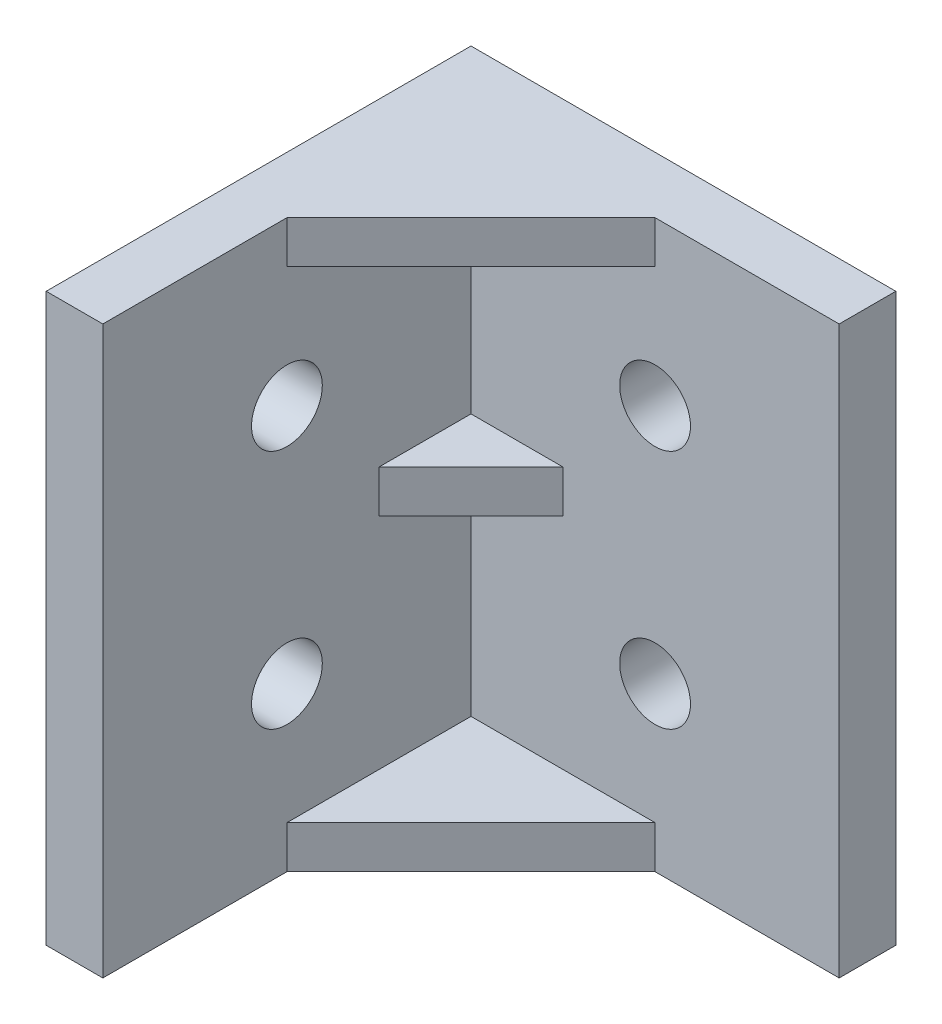
ISO-10303-21;
HEADER;
FILE_DESCRIPTION(('STEP AP214'),'2;1');
FILE_NAME('part.step','',(''),(''),'','','');
FILE_SCHEMA(('AUTOMOTIVE_DESIGN { 1 0 10303 214 1 1 1 1 }'));
ENDSEC;
DATA;
#1=APPLICATION_CONTEXT('core data for automotive mechanical design processes');
#2=APPLICATION_PROTOCOL_DEFINITION('international standard','automotive_design',2000,#1);
#3=PRODUCT_CONTEXT('',#1,'mechanical');
#4=PRODUCT('Part','Part','',(#3));
#5=PRODUCT_RELATED_PRODUCT_CATEGORY('part','',(#4));
#6=PRODUCT_DEFINITION_FORMATION('','',#4);
#7=PRODUCT_DEFINITION_CONTEXT('part definition',#1,'design');
#8=PRODUCT_DEFINITION('design','',#6,#7);
#9=PRODUCT_DEFINITION_SHAPE('','',#8);
#10=(LENGTH_UNIT() NAMED_UNIT(*) SI_UNIT(.MILLI.,.METRE.));
#11=(NAMED_UNIT(*) PLANE_ANGLE_UNIT() SI_UNIT($,.RADIAN.));
#12=(NAMED_UNIT(*) SI_UNIT($,.STERADIAN.) SOLID_ANGLE_UNIT());
#13=UNCERTAINTY_MEASURE_WITH_UNIT(LENGTH_MEASURE(1.E-05),#10,'distance_accuracy_value','');
#14=(GEOMETRIC_REPRESENTATION_CONTEXT(3) GLOBAL_UNCERTAINTY_ASSIGNED_CONTEXT((#13)) GLOBAL_UNIT_ASSIGNED_CONTEXT((#10,
#11,#12)) REPRESENTATION_CONTEXT('',''));
#15=CARTESIAN_POINT('',(0.,0.,0.));
#16=DIRECTION('',(0.,0.,1.));
#17=DIRECTION('',(1.,0.,0.));
#18=AXIS2_PLACEMENT_3D('',#15,#16,#17);
#19=CARTESIAN_POINT('',(-23.5152207469861,20.,-12.3737755770845));
#20=DIRECTION('',(1.,0.,0.));
#21=DIRECTION('',(0.,0.,-1.));
#22=AXIS2_PLACEMENT_3D('',#19,#20,#21);
#23=PLANE('',#22);
#24=CARTESIAN_POINT('',(-23.5152207469861,8.5,4.62622442291549));
#25=DIRECTION('',(1.,0.,0.));
#26=DIRECTION('',(0.,0.,-1.));
#27=AXIS2_PLACEMENT_3D('',#24,#25,#26);
#28=CIRCLE('',#27,2.5);
#29=CARTESIAN_POINT('',(-23.5152207469861,8.5,2.12622442291549));
#30=VERTEX_POINT('',#29);
#31=EDGE_CURVE('E274',#30,#30,#28,.T.);
#32=ORIENTED_EDGE('',*,*,#31,.T.);
#33=EDGE_LOOP('',(#32));
#34=FACE_BOUND('',#33,.T.);
#35=CARTESIAN_POINT('',(-23.5152207469861,-8.5,4.62622442291549));
#36=DIRECTION('',(1.,0.,0.));
#37=DIRECTION('',(0.,0.,-1.));
#38=AXIS2_PLACEMENT_3D('',#35,#36,#37);
#39=CIRCLE('',#38,2.5);
#40=CARTESIAN_POINT('',(-23.5152207469861,-8.5,2.12622442291549));
#41=VERTEX_POINT('',#40);
#42=EDGE_CURVE('E144',#41,#41,#39,.T.);
#43=ORIENTED_EDGE('',*,*,#42,.T.);
#44=EDGE_LOOP('',(#43));
#45=FACE_BOUND('',#44,.T.);
#46=DIRECTION('',(0.,0.,1.));
#47=VECTOR('',#46,1.);
#48=CARTESIAN_POINT('',(-23.5152207469861,-20.,-12.3737755770845));
#49=LINE('',#48,#47);
#50=CARTESIAN_POINT('',(-23.5152207469861,-20.,-12.3737755770845));
#51=VERTEX_POINT('',#50);
#52=CARTESIAN_POINT('',(-23.5152207469861,-20.,17.6262244229155));
#53=VERTEX_POINT('',#52);
#54=EDGE_CURVE('E185',#51,#53,#49,.T.);
#55=ORIENTED_EDGE('',*,*,#54,.T.);
#56=DIRECTION('',(0.,-1.,0.));
#57=VECTOR('',#56,1.);
#58=CARTESIAN_POINT('',(-23.5152207469861,20.,17.6262244229155));
#59=LINE('',#58,#57);
#60=CARTESIAN_POINT('',(-23.5152207469861,20.,17.6262244229155));
#61=VERTEX_POINT('',#60);
#62=EDGE_CURVE('E11',#61,#53,#59,.T.);
#63=ORIENTED_EDGE('',*,*,#62,.F.);
#64=DIRECTION('',(0.,0.,1.));
#65=VECTOR('',#64,1.);
#66=CARTESIAN_POINT('',(-23.5152207469861,20.,-12.3737755770845));
#67=LINE('',#66,#65);
#68=CARTESIAN_POINT('',(-23.5152207469861,20.,-12.3737755770845));
#69=VERTEX_POINT('',#68);
#70=EDGE_CURVE('E188',#69,#61,#67,.T.);
#71=ORIENTED_EDGE('',*,*,#70,.F.);
#72=DIRECTION('',(0.,-1.,0.));
#73=VECTOR('',#72,1.);
#74=CARTESIAN_POINT('',(-23.5152207469861,20.,-12.3737755770845));
#75=LINE('',#74,#73);
#76=EDGE_CURVE('E203',#69,#51,#75,.T.);
#77=ORIENTED_EDGE('',*,*,#76,.T.);
#78=EDGE_LOOP('',(#55,#63,#71,#77));
#79=FACE_BOUND('',#78,.T.);
#80=ADVANCED_FACE('F33',(#34,#45,#79),#23,.F.);
#81=CARTESIAN_POINT('',(-23.5152207469861,20.,17.6262244229155));
#82=DIRECTION('',(0.,0.,-1.));
#83=DIRECTION('',(-1.,0.,0.));
#84=AXIS2_PLACEMENT_3D('',#81,#82,#83);
#85=PLANE('',#84);
#86=DIRECTION('',(1.,0.,0.));
#87=VECTOR('',#86,1.);
#88=CARTESIAN_POINT('',(-23.5152207469861,-20.,17.6262244229155));
#89=LINE('',#88,#87);
#90=CARTESIAN_POINT('',(-19.5152207469861,-20.,17.6262244229155));
#91=VERTEX_POINT('',#90);
#92=EDGE_CURVE('E206',#53,#91,#89,.T.);
#93=ORIENTED_EDGE('',*,*,#92,.T.);
#94=DIRECTION('',(0.,-1.,0.));
#95=VECTOR('',#94,1.);
#96=CARTESIAN_POINT('',(-19.5152207469861,20.,17.6262244229155));
#97=LINE('',#96,#95);
#98=CARTESIAN_POINT('',(-19.5152207469861,20.,17.6262244229155));
#99=VERTEX_POINT('',#98);
#100=EDGE_CURVE('E40',#99,#91,#97,.T.);
#101=ORIENTED_EDGE('',*,*,#100,.F.);
#102=DIRECTION('',(1.,0.,0.));
#103=VECTOR('',#102,1.);
#104=CARTESIAN_POINT('',(-23.5152207469861,20.,17.6262244229155));
#105=LINE('',#104,#103);
#106=EDGE_CURVE('E191',#61,#99,#105,.T.);
#107=ORIENTED_EDGE('',*,*,#106,.F.);
#108=ORIENTED_EDGE('',*,*,#62,.T.);
#109=EDGE_LOOP('',(#93,#101,#107,#108));
#110=FACE_BOUND('',#109,.T.);
#111=ADVANCED_FACE('F320',(#110),#85,.F.);
#112=CARTESIAN_POINT('',(-19.5152207469861,20.,-8.37377557708452));
#113=DIRECTION('',(-1.,0.,0.));
#114=DIRECTION('',(0.,0.,1.));
#115=AXIS2_PLACEMENT_3D('',#112,#113,#114);
#116=PLANE('',#115);
#117=CARTESIAN_POINT('',(-19.5152207469861,8.5,4.62622442291549));
#118=DIRECTION('',(1.,0.,0.));
#119=DIRECTION('',(0.,0.,-1.));
#120=AXIS2_PLACEMENT_3D('',#117,#118,#119);
#121=CIRCLE('',#120,2.5);
#122=CARTESIAN_POINT('',(-19.5152207469861,8.5,2.12622442291549));
#123=VERTEX_POINT('',#122);
#124=EDGE_CURVE('E276',#123,#123,#121,.T.);
#125=ORIENTED_EDGE('',*,*,#124,.F.);
#126=EDGE_LOOP('',(#125));
#127=FACE_BOUND('',#126,.T.);
#128=CARTESIAN_POINT('',(-19.5152207469861,-8.5,4.62622442291549));
#129=DIRECTION('',(1.,0.,0.));
#130=DIRECTION('',(0.,0.,-1.));
#131=AXIS2_PLACEMENT_3D('',#128,#129,#130);
#132=CIRCLE('',#131,2.5);
#133=CARTESIAN_POINT('',(-19.5152207469861,-8.5,2.12622442291549));
#134=VERTEX_POINT('',#133);
#135=EDGE_CURVE('E148',#134,#134,#132,.T.);
#136=ORIENTED_EDGE('',*,*,#135,.F.);
#137=EDGE_LOOP('',(#136));
#138=FACE_BOUND('',#137,.T.);
#139=DIRECTION('',(0.,-1.,0.));
#140=VECTOR('',#139,1.);
#141=CARTESIAN_POINT('',(-19.5152207469861,1.5,-1.87377557708451));
#142=LINE('',#141,#140);
#143=CARTESIAN_POINT('',(-19.5152207469861,1.5,-1.87377557708451));
#144=VERTEX_POINT('',#143);
#145=CARTESIAN_POINT('',(-19.5152207469861,-1.5,-1.87377557708451));
#146=VERTEX_POINT('',#145);
#147=EDGE_CURVE('E47',#144,#146,#142,.T.);
#148=ORIENTED_EDGE('',*,*,#147,.F.);
#149=DIRECTION('',(0.,0.,1.));
#150=VECTOR('',#149,1.);
#151=CARTESIAN_POINT('',(-19.5152207469861,1.5,-1.87377557708451));
#152=LINE('',#151,#150);
#153=CARTESIAN_POINT('',(-19.5152207469861,1.5,-8.37377557708452));
#154=VERTEX_POINT('',#153);
#155=EDGE_CURVE('E268',#154,#144,#152,.T.);
#156=ORIENTED_EDGE('',*,*,#155,.F.);
#157=DIRECTION('',(0.,-1.,0.));
#158=VECTOR('',#157,1.);
#159=CARTESIAN_POINT('',(-19.5152207469861,20.,-8.37377557708452));
#160=LINE('',#159,#158);
#161=CARTESIAN_POINT('',(-19.5152207469861,17.,-8.37377557708452));
#162=VERTEX_POINT('',#161);
#163=EDGE_CURVE('E224',#162,#154,#160,.T.);
#164=ORIENTED_EDGE('',*,*,#163,.F.);
#165=DIRECTION('',(0.,0.,1.));
#166=VECTOR('',#165,1.);
#167=CARTESIAN_POINT('',(-19.5152207469861,17.,4.62622442291549));
#168=LINE('',#167,#166);
#169=CARTESIAN_POINT('',(-19.5152207469861,17.,4.62622442291549));
#170=VERTEX_POINT('',#169);
#171=EDGE_CURVE('E158',#162,#170,#168,.T.);
#172=ORIENTED_EDGE('',*,*,#171,.T.);
#173=DIRECTION('',(0.,1.,0.));
#174=VECTOR('',#173,1.);
#175=CARTESIAN_POINT('',(-19.5152207469861,17.,4.62622442291549));
#176=LINE('',#175,#174);
#177=CARTESIAN_POINT('',(-19.5152207469861,20.,4.62622442291549));
#178=VERTEX_POINT('',#177);
#179=EDGE_CURVE('E164',#170,#178,#176,.T.);
#180=ORIENTED_EDGE('',*,*,#179,.T.);
#181=DIRECTION('',(0.,0.,-1.));
#182=VECTOR('',#181,1.);
#183=CARTESIAN_POINT('',(-19.5152207469861,20.,-8.37377557708452));
#184=LINE('',#183,#182);
#185=EDGE_CURVE('E194',#99,#178,#184,.T.);
#186=ORIENTED_EDGE('',*,*,#185,.F.);
#187=ORIENTED_EDGE('',*,*,#100,.T.);
#188=DIRECTION('',(0.,0.,-1.));
#189=VECTOR('',#188,1.);
#190=CARTESIAN_POINT('',(-19.5152207469861,-20.,-8.37377557708452));
#191=LINE('',#190,#189);
#192=CARTESIAN_POINT('',(-19.5152207469861,-20.,4.62622442291548));
#193=VERTEX_POINT('',#192);
#194=EDGE_CURVE('E208',#91,#193,#191,.T.);
#195=ORIENTED_EDGE('',*,*,#194,.T.);
#196=DIRECTION('',(0.,-1.,0.));
#197=VECTOR('',#196,1.);
#198=CARTESIAN_POINT('',(-19.5152207469861,-17.,4.62622442291549));
#199=LINE('',#198,#197);
#200=CARTESIAN_POINT('',(-19.5152207469861,-17.,4.62622442291549));
#201=VERTEX_POINT('',#200);
#202=EDGE_CURVE('E180',#201,#193,#199,.T.);
#203=ORIENTED_EDGE('',*,*,#202,.F.);
#204=DIRECTION('',(0.,0.,-1.));
#205=VECTOR('',#204,1.);
#206=CARTESIAN_POINT('',(-19.5152207469861,-17.,-8.37377557708452));
#207=LINE('',#206,#205);
#208=CARTESIAN_POINT('',(-19.5152207469861,-17.,-8.37377557708452));
#209=VERTEX_POINT('',#208);
#210=EDGE_CURVE('E175',#201,#209,#207,.T.);
#211=ORIENTED_EDGE('',*,*,#210,.T.);
#212=CARTESIAN_POINT('',(-19.5152207469861,-1.5,-8.37377557708452));
#213=VERTEX_POINT('',#212);
#214=EDGE_CURVE('E223',#213,#209,#160,.T.);
#215=ORIENTED_EDGE('',*,*,#214,.F.);
#216=DIRECTION('',(0.,0.,1.));
#217=VECTOR('',#216,1.);
#218=CARTESIAN_POINT('',(-19.5152207469861,-1.5,-1.87377557708451));
#219=LINE('',#218,#217);
#220=EDGE_CURVE('E52',#213,#146,#219,.T.);
#221=ORIENTED_EDGE('',*,*,#220,.T.);
#222=EDGE_LOOP('',(#148,#156,#164,#172,#180,#186,#187,#195,#203,#211,#215,#221));
#223=FACE_BOUND('',#222,.T.);
#224=ADVANCED_FACE('F229',(#127,#138,#223),#116,.F.);
#225=CARTESIAN_POINT('',(-19.5152207469861,20.,-8.37377557708452));
#226=DIRECTION('',(0.,0.,-1.));
#227=DIRECTION('',(-1.,0.,0.));
#228=AXIS2_PLACEMENT_3D('',#225,#226,#227);
#229=PLANE('',#228);
#230=CARTESIAN_POINT('',(-6.5152207469861,8.5,-8.37377557708452));
#231=DIRECTION('',(0.,0.,1.));
#232=DIRECTION('',(1.,0.,0.));
#233=AXIS2_PLACEMENT_3D('',#230,#231,#232);
#234=CIRCLE('',#233,2.5);
#235=CARTESIAN_POINT('',(-4.0152207469861,8.5,-8.37377557708452));
#236=VERTEX_POINT('',#235);
#237=EDGE_CURVE('E288',#236,#236,#234,.T.);
#238=ORIENTED_EDGE('',*,*,#237,.F.);
#239=EDGE_LOOP('',(#238));
#240=FACE_BOUND('',#239,.T.);
#241=CARTESIAN_POINT('',(-6.5152207469861,-8.5,-8.37377557708452));
#242=DIRECTION('',(0.,0.,1.));
#243=DIRECTION('',(1.,0.,0.));
#244=AXIS2_PLACEMENT_3D('',#241,#242,#243);
#245=CIRCLE('',#244,2.5);
#246=CARTESIAN_POINT('',(-4.0152207469861,-8.5,-8.37377557708452));
#247=VERTEX_POINT('',#246);
#248=EDGE_CURVE('E282',#247,#247,#245,.T.);
#249=ORIENTED_EDGE('',*,*,#248,.F.);
#250=EDGE_LOOP('',(#249));
#251=FACE_BOUND('',#250,.T.);
#252=ORIENTED_EDGE('',*,*,#163,.T.);
#253=DIRECTION('',(-1.,0.,0.));
#254=VECTOR('',#253,1.);
#255=CARTESIAN_POINT('',(-19.5152207469861,1.5,-8.37377557708452));
#256=LINE('',#255,#254);
#257=CARTESIAN_POINT('',(-13.0152207469861,1.5,-8.37377557708452));
#258=VERTEX_POINT('',#257);
#259=EDGE_CURVE('E132',#258,#154,#256,.T.);
#260=ORIENTED_EDGE('',*,*,#259,.F.);
#261=DIRECTION('',(0.,-1.,0.));
#262=VECTOR('',#261,1.);
#263=CARTESIAN_POINT('',(-13.0152207469861,1.5,-8.37377557708452));
#264=LINE('',#263,#262);
#265=CARTESIAN_POINT('',(-13.0152207469861,-1.5,-8.37377557708452));
#266=VERTEX_POINT('',#265);
#267=EDGE_CURVE('E125',#258,#266,#264,.T.);
#268=ORIENTED_EDGE('',*,*,#267,.T.);
#269=DIRECTION('',(-1.,0.,0.));
#270=VECTOR('',#269,1.);
#271=CARTESIAN_POINT('',(-19.5152207469861,-1.5,-8.37377557708452));
#272=LINE('',#271,#270);
#273=EDGE_CURVE('E130',#266,#213,#272,.T.);
#274=ORIENTED_EDGE('',*,*,#273,.T.);
#275=ORIENTED_EDGE('',*,*,#214,.T.);
#276=DIRECTION('',(1.,0.,0.));
#277=VECTOR('',#276,1.);
#278=CARTESIAN_POINT('',(-6.5152207469861,-17.,-8.37377557708452));
#279=LINE('',#278,#277);
#280=CARTESIAN_POINT('',(-6.5152207469861,-17.,-8.37377557708452));
#281=VERTEX_POINT('',#280);
#282=EDGE_CURVE('E178',#209,#281,#279,.T.);
#283=ORIENTED_EDGE('',*,*,#282,.T.);
#284=DIRECTION('',(0.,-1.,0.));
#285=VECTOR('',#284,1.);
#286=CARTESIAN_POINT('',(-6.5152207469861,-17.,-8.37377557708452));
#287=LINE('',#286,#285);
#288=CARTESIAN_POINT('',(-6.5152207469861,-20.,-8.37377557708452));
#289=VERTEX_POINT('',#288);
#290=EDGE_CURVE('E183',#281,#289,#287,.T.);
#291=ORIENTED_EDGE('',*,*,#290,.T.);
#292=DIRECTION('',(1.,0.,0.));
#293=VECTOR('',#292,1.);
#294=CARTESIAN_POINT('',(-19.5152207469861,-20.,-8.37377557708452));
#295=LINE('',#294,#293);
#296=CARTESIAN_POINT('',(6.4847792530139,-20.,-8.37377557708452));
#297=VERTEX_POINT('',#296);
#298=EDGE_CURVE('E210',#289,#297,#295,.T.);
#299=ORIENTED_EDGE('',*,*,#298,.T.);
#300=DIRECTION('',(0.,-1.,0.));
#301=VECTOR('',#300,1.);
#302=CARTESIAN_POINT('',(6.4847792530139,20.,-8.37377557708452));
#303=LINE('',#302,#301);
#304=CARTESIAN_POINT('',(6.4847792530139,20.,-8.37377557708452));
#305=VERTEX_POINT('',#304);
#306=EDGE_CURVE('E220',#305,#297,#303,.T.);
#307=ORIENTED_EDGE('',*,*,#306,.F.);
#308=DIRECTION('',(1.,0.,0.));
#309=VECTOR('',#308,1.);
#310=CARTESIAN_POINT('',(-19.5152207469861,20.,-8.37377557708452));
#311=LINE('',#310,#309);
#312=CARTESIAN_POINT('',(-6.5152207469861,20.,-8.37377557708452));
#313=VERTEX_POINT('',#312);
#314=EDGE_CURVE('E197',#313,#305,#311,.T.);
#315=ORIENTED_EDGE('',*,*,#314,.F.);
#316=DIRECTION('',(0.,1.,0.));
#317=VECTOR('',#316,1.);
#318=CARTESIAN_POINT('',(-6.5152207469861,17.,-8.37377557708452));
#319=LINE('',#318,#317);
#320=CARTESIAN_POINT('',(-6.5152207469861,17.,-8.37377557708452));
#321=VERTEX_POINT('',#320);
#322=EDGE_CURVE('E167',#321,#313,#319,.T.);
#323=ORIENTED_EDGE('',*,*,#322,.F.);
#324=DIRECTION('',(-1.,0.,0.));
#325=VECTOR('',#324,1.);
#326=CARTESIAN_POINT('',(-19.5152207469861,17.,-8.37377557708452));
#327=LINE('',#326,#325);
#328=EDGE_CURVE('E155',#321,#162,#327,.T.);
#329=ORIENTED_EDGE('',*,*,#328,.T.);
#330=EDGE_LOOP('',(#252,#260,#268,#274,#275,#283,#291,#299,#307,#315,#323,#329));
#331=FACE_BOUND('',#330,.T.);
#332=ADVANCED_FACE('F128',(#240,#251,#331),#229,.F.);
#333=CARTESIAN_POINT('',(6.4847792530139,20.,-12.3737755770845));
#334=DIRECTION('',(-1.,0.,0.));
#335=DIRECTION('',(0.,0.,1.));
#336=AXIS2_PLACEMENT_3D('',#333,#334,#335);
#337=PLANE('',#336);
#338=DIRECTION('',(0.,0.,-1.));
#339=VECTOR('',#338,1.);
#340=CARTESIAN_POINT('',(6.4847792530139,-20.,-12.3737755770845));
#341=LINE('',#340,#339);
#342=CARTESIAN_POINT('',(6.4847792530139,-20.,-12.3737755770845));
#343=VERTEX_POINT('',#342);
#344=EDGE_CURVE('E212',#297,#343,#341,.T.);
#345=ORIENTED_EDGE('',*,*,#344,.T.);
#346=DIRECTION('',(0.,-1.,0.));
#347=VECTOR('',#346,1.);
#348=CARTESIAN_POINT('',(6.4847792530139,20.,-12.3737755770845));
#349=LINE('',#348,#347);
#350=CARTESIAN_POINT('',(6.4847792530139,20.,-12.3737755770845));
#351=VERTEX_POINT('',#350);
#352=EDGE_CURVE('E217',#351,#343,#349,.T.);
#353=ORIENTED_EDGE('',*,*,#352,.F.);
#354=DIRECTION('',(0.,0.,-1.));
#355=VECTOR('',#354,1.);
#356=CARTESIAN_POINT('',(6.4847792530139,20.,-12.3737755770845));
#357=LINE('',#356,#355);
#358=EDGE_CURVE('E199',#305,#351,#357,.T.);
#359=ORIENTED_EDGE('',*,*,#358,.F.);
#360=ORIENTED_EDGE('',*,*,#306,.T.);
#361=EDGE_LOOP('',(#345,#353,#359,#360));
#362=FACE_BOUND('',#361,.T.);
#363=ADVANCED_FACE('F249',(#362),#337,.F.);
#364=CARTESIAN_POINT('',(-23.5152207469861,20.,-12.3737755770845));
#365=DIRECTION('',(0.,0.,1.));
#366=DIRECTION('',(1.,0.,0.));
#367=AXIS2_PLACEMENT_3D('',#364,#365,#366);
#368=PLANE('',#367);
#369=CARTESIAN_POINT('',(-6.5152207469861,8.5,-12.3737755770845));
#370=DIRECTION('',(0.,0.,1.));
#371=DIRECTION('',(1.,0.,0.));
#372=AXIS2_PLACEMENT_3D('',#369,#370,#371);
#373=CIRCLE('',#372,2.5);
#374=CARTESIAN_POINT('',(-4.0152207469861,8.5,-12.3737755770845));
#375=VERTEX_POINT('',#374);
#376=EDGE_CURVE('E285',#375,#375,#373,.T.);
#377=ORIENTED_EDGE('',*,*,#376,.T.);
#378=EDGE_LOOP('',(#377));
#379=FACE_BOUND('',#378,.T.);
#380=CARTESIAN_POINT('',(-6.5152207469861,-8.5,-12.3737755770845));
#381=DIRECTION('',(0.,0.,1.));
#382=DIRECTION('',(1.,0.,0.));
#383=AXIS2_PLACEMENT_3D('',#380,#381,#382);
#384=CIRCLE('',#383,2.5);
#385=CARTESIAN_POINT('',(-4.0152207469861,-8.5,-12.3737755770845));
#386=VERTEX_POINT('',#385);
#387=EDGE_CURVE('E279',#386,#386,#384,.T.);
#388=ORIENTED_EDGE('',*,*,#387,.T.);
#389=EDGE_LOOP('',(#388));
#390=FACE_BOUND('',#389,.T.);
#391=DIRECTION('',(-1.,0.,0.));
#392=VECTOR('',#391,1.);
#393=CARTESIAN_POINT('',(-23.5152207469861,-20.,-12.3737755770845));
#394=LINE('',#393,#392);
#395=EDGE_CURVE('E192',#343,#51,#394,.T.);
#396=ORIENTED_EDGE('',*,*,#395,.T.);
#397=ORIENTED_EDGE('',*,*,#76,.F.);
#398=DIRECTION('',(-1.,0.,0.));
#399=VECTOR('',#398,1.);
#400=CARTESIAN_POINT('',(-23.5152207469861,20.,-12.3737755770845));
#401=LINE('',#400,#399);
#402=EDGE_CURVE('E201',#351,#69,#401,.T.);
#403=ORIENTED_EDGE('',*,*,#402,.F.);
#404=ORIENTED_EDGE('',*,*,#352,.T.);
#405=EDGE_LOOP('',(#396,#397,#403,#404));
#406=FACE_BOUND('',#405,.T.);
#407=ADVANCED_FACE('F254',(#379,#390,#406),#368,.F.);
#408=CARTESIAN_POINT('',(0.,20.,0.));
#409=DIRECTION('',(0.,1.,0.));
#410=DIRECTION('',(0.,0.,1.));
#411=AXIS2_PLACEMENT_3D('',#408,#409,#410);
#412=PLANE('',#411);
#413=DIRECTION('',(0.707106781186548,0.,-0.707106781186548));
#414=VECTOR('',#413,1.);
#415=CARTESIAN_POINT('',(-6.5152207469861,20.,-8.37377557708452));
#416=LINE('',#415,#414);
#417=EDGE_CURVE('E154',#178,#313,#416,.T.);
#418=ORIENTED_EDGE('',*,*,#417,.T.);
#419=ORIENTED_EDGE('',*,*,#314,.T.);
#420=ORIENTED_EDGE('',*,*,#358,.T.);
#421=ORIENTED_EDGE('',*,*,#402,.T.);
#422=ORIENTED_EDGE('',*,*,#70,.T.);
#423=ORIENTED_EDGE('',*,*,#106,.T.);
#424=ORIENTED_EDGE('',*,*,#185,.T.);
#425=EDGE_LOOP('',(#418,#419,#420,#421,#422,#423,#424));
#426=FACE_BOUND('',#425,.T.);
#427=ADVANCED_FACE('F260',(#426),#412,.T.);
#428=CARTESIAN_POINT('',(0.,-20.,0.));
#429=DIRECTION('',(0.,1.,0.));
#430=DIRECTION('',(0.,0.,1.));
#431=AXIS2_PLACEMENT_3D('',#428,#429,#430);
#432=PLANE('',#431);
#433=ORIENTED_EDGE('',*,*,#298,.F.);
#434=DIRECTION('',(-0.707106781186548,0.,0.707106781186548));
#435=VECTOR('',#434,1.);
#436=CARTESIAN_POINT('',(-19.5152207469861,-20.,4.62622442291549));
#437=LINE('',#436,#435);
#438=EDGE_CURVE('E169',#289,#193,#437,.T.);
#439=ORIENTED_EDGE('',*,*,#438,.T.);
#440=ORIENTED_EDGE('',*,*,#194,.F.);
#441=ORIENTED_EDGE('',*,*,#92,.F.);
#442=ORIENTED_EDGE('',*,*,#54,.F.);
#443=ORIENTED_EDGE('',*,*,#395,.F.);
#444=ORIENTED_EDGE('',*,*,#344,.F.);
#445=EDGE_LOOP('',(#433,#439,#440,#441,#442,#443,#444));
#446=FACE_BOUND('',#445,.T.);
#447=ADVANCED_FACE('F233',(#446),#432,.F.);
#448=CARTESIAN_POINT('',(-19.5152207469861,-17.,4.62622442291549));
#449=DIRECTION('',(0.707106781186548,0.,0.707106781186547));
#450=DIRECTION('',(0.707106781186547,0.,-0.707106781186548));
#451=AXIS2_PLACEMENT_3D('',#448,#449,#450);
#452=PLANE('',#451);
#453=ORIENTED_EDGE('',*,*,#438,.F.);
#454=ORIENTED_EDGE('',*,*,#290,.F.);
#455=DIRECTION('',(-0.707106781186548,0.,0.707106781186548));
#456=VECTOR('',#455,1.);
#457=CARTESIAN_POINT('',(-19.5152207469861,-17.,4.62622442291549));
#458=LINE('',#457,#456);
#459=EDGE_CURVE('E172',#281,#201,#458,.T.);
#460=ORIENTED_EDGE('',*,*,#459,.T.);
#461=ORIENTED_EDGE('',*,*,#202,.T.);
#462=EDGE_LOOP('',(#453,#454,#460,#461));
#463=FACE_BOUND('',#462,.T.);
#464=ADVANCED_FACE('F239',(#463),#452,.T.);
#465=CARTESIAN_POINT('',(0.,-17.,0.));
#466=DIRECTION('',(0.,1.,0.));
#467=DIRECTION('',(0.,0.,1.));
#468=AXIS2_PLACEMENT_3D('',#465,#466,#467);
#469=PLANE('',#468);
#470=ORIENTED_EDGE('',*,*,#459,.F.);
#471=ORIENTED_EDGE('',*,*,#282,.F.);
#472=ORIENTED_EDGE('',*,*,#210,.F.);
#473=EDGE_LOOP('',(#470,#471,#472));
#474=FACE_BOUND('',#473,.T.);
#475=ADVANCED_FACE('F244',(#474),#469,.T.);
#476=CARTESIAN_POINT('',(-6.5152207469861,17.,-8.37377557708452));
#477=DIRECTION('',(0.707106781186548,0.,0.707106781186547));
#478=DIRECTION('',(0.707106781186547,0.,-0.707106781186548));
#479=AXIS2_PLACEMENT_3D('',#476,#477,#478);
#480=PLANE('',#479);
#481=ORIENTED_EDGE('',*,*,#417,.F.);
#482=ORIENTED_EDGE('',*,*,#179,.F.);
#483=DIRECTION('',(0.707106781186548,0.,-0.707106781186548));
#484=VECTOR('',#483,1.);
#485=CARTESIAN_POINT('',(-6.5152207469861,17.,-8.37377557708452));
#486=LINE('',#485,#484);
#487=EDGE_CURVE('E161',#170,#321,#486,.T.);
#488=ORIENTED_EDGE('',*,*,#487,.T.);
#489=ORIENTED_EDGE('',*,*,#322,.T.);
#490=EDGE_LOOP('',(#481,#482,#488,#489));
#491=FACE_BOUND('',#490,.T.);
#492=ADVANCED_FACE('F264',(#491),#480,.T.);
#493=CARTESIAN_POINT('',(0.,17.,0.));
#494=DIRECTION('',(0.,1.,0.));
#495=DIRECTION('',(0.,0.,1.));
#496=AXIS2_PLACEMENT_3D('',#493,#494,#495);
#497=PLANE('',#496);
#498=ORIENTED_EDGE('',*,*,#328,.F.);
#499=ORIENTED_EDGE('',*,*,#487,.F.);
#500=ORIENTED_EDGE('',*,*,#171,.F.);
#501=EDGE_LOOP('',(#498,#499,#500));
#502=FACE_BOUND('',#501,.T.);
#503=ADVANCED_FACE('F267',(#502),#497,.F.);
#504=CARTESIAN_POINT('',(-13.0152207469861,1.5,-8.37377557708452));
#505=DIRECTION('',(-0.707106781186548,0.,-0.707106781186547));
#506=DIRECTION('',(-0.707106781186547,0.,0.707106781186548));
#507=AXIS2_PLACEMENT_3D('',#504,#505,#506);
#508=PLANE('',#507);
#509=DIRECTION('',(0.707106781186548,0.,-0.707106781186548));
#510=VECTOR('',#509,1.);
#511=CARTESIAN_POINT('',(-13.0152207469861,-1.5,-8.37377557708452));
#512=LINE('',#511,#510);
#513=EDGE_CURVE('E139',#146,#266,#512,.T.);
#514=ORIENTED_EDGE('',*,*,#513,.T.);
#515=ORIENTED_EDGE('',*,*,#267,.F.);
#516=DIRECTION('',(0.707106781186548,0.,-0.707106781186548));
#517=VECTOR('',#516,1.);
#518=CARTESIAN_POINT('',(-13.0152207469861,1.5,-8.37377557708452));
#519=LINE('',#518,#517);
#520=EDGE_CURVE('E136',#144,#258,#519,.T.);
#521=ORIENTED_EDGE('',*,*,#520,.F.);
#522=ORIENTED_EDGE('',*,*,#147,.T.);
#523=EDGE_LOOP('',(#514,#515,#521,#522));
#524=FACE_BOUND('',#523,.T.);
#525=ADVANCED_FACE('F140',(#524),#508,.F.);
#526=CARTESIAN_POINT('',(0.,1.5,0.));
#527=DIRECTION('',(0.,1.,0.));
#528=DIRECTION('',(0.,0.,1.));
#529=AXIS2_PLACEMENT_3D('',#526,#527,#528);
#530=PLANE('',#529);
#531=ORIENTED_EDGE('',*,*,#259,.T.);
#532=ORIENTED_EDGE('',*,*,#155,.T.);
#533=ORIENTED_EDGE('',*,*,#520,.T.);
#534=EDGE_LOOP('',(#531,#532,#533));
#535=FACE_BOUND('',#534,.T.);
#536=ADVANCED_FACE('F270',(#535),#530,.T.);
#537=CARTESIAN_POINT('',(0.,-1.5,0.));
#538=DIRECTION('',(0.,1.,0.));
#539=DIRECTION('',(0.,0.,1.));
#540=AXIS2_PLACEMENT_3D('',#537,#538,#539);
#541=PLANE('',#540);
#542=ORIENTED_EDGE('',*,*,#273,.F.);
#543=ORIENTED_EDGE('',*,*,#513,.F.);
#544=ORIENTED_EDGE('',*,*,#220,.F.);
#545=EDGE_LOOP('',(#542,#543,#544));
#546=FACE_BOUND('',#545,.T.);
#547=ADVANCED_FACE('F143',(#546),#541,.F.);
#548=CARTESIAN_POINT('',(-23.5152207469861,-8.5,4.62622442291549));
#549=DIRECTION('',(1.,0.,0.));
#550=DIRECTION('',(0.,0.,-1.));
#551=AXIS2_PLACEMENT_3D('',#548,#549,#550);
#552=CYLINDRICAL_SURFACE('',#551,2.5);
#553=ORIENTED_EDGE('',*,*,#42,.F.);
#554=EDGE_LOOP('',(#553));
#555=FACE_BOUND('',#554,.T.);
#556=ORIENTED_EDGE('',*,*,#135,.T.);
#557=EDGE_LOOP('',(#556));
#558=FACE_BOUND('',#557,.T.);
#559=ADVANCED_FACE('F315',(#555,#558),#552,.F.);
#560=CARTESIAN_POINT('',(-23.5152207469861,8.5,4.62622442291549));
#561=DIRECTION('',(1.,0.,0.));
#562=DIRECTION('',(0.,0.,-1.));
#563=AXIS2_PLACEMENT_3D('',#560,#561,#562);
#564=CYLINDRICAL_SURFACE('',#563,2.5);
#565=ORIENTED_EDGE('',*,*,#31,.F.);
#566=EDGE_LOOP('',(#565));
#567=FACE_BOUND('',#566,.T.);
#568=ORIENTED_EDGE('',*,*,#124,.T.);
#569=EDGE_LOOP('',(#568));
#570=FACE_BOUND('',#569,.T.);
#571=ADVANCED_FACE('F309',(#567,#570),#564,.F.);
#572=CARTESIAN_POINT('',(-6.5152207469861,-8.5,-12.3737755770845));
#573=DIRECTION('',(0.,0.,1.));
#574=DIRECTION('',(1.,0.,0.));
#575=AXIS2_PLACEMENT_3D('',#572,#573,#574);
#576=CYLINDRICAL_SURFACE('',#575,2.5);
#577=ORIENTED_EDGE('',*,*,#387,.F.);
#578=EDGE_LOOP('',(#577));
#579=FACE_BOUND('',#578,.T.);
#580=ORIENTED_EDGE('',*,*,#248,.T.);
#581=EDGE_LOOP('',(#580));
#582=FACE_BOUND('',#581,.T.);
#583=ADVANCED_FACE('F299',(#579,#582),#576,.F.);
#584=CARTESIAN_POINT('',(-6.5152207469861,8.5,-12.3737755770845));
#585=DIRECTION('',(0.,0.,1.));
#586=DIRECTION('',(1.,0.,0.));
#587=AXIS2_PLACEMENT_3D('',#584,#585,#586);
#588=CYLINDRICAL_SURFACE('',#587,2.5);
#589=ORIENTED_EDGE('',*,*,#376,.F.);
#590=EDGE_LOOP('',(#589));
#591=FACE_BOUND('',#590,.T.);
#592=ORIENTED_EDGE('',*,*,#237,.T.);
#593=EDGE_LOOP('',(#592));
#594=FACE_BOUND('',#593,.T.);
#595=ADVANCED_FACE('F296',(#591,#594),#588,.F.);
#596=CLOSED_SHELL('',(#80,#111,#224,#332,#363,#407,#427,#447,#464,#475,#492,#503,#525,#536,#547,
#559,#571,#583,#595));
#597=MANIFOLD_SOLID_BREP('B2',#596);
#598=ADVANCED_BREP_SHAPE_REPRESENTATION('',(#18,#597),#14);
#599=SHAPE_DEFINITION_REPRESENTATION(#9,#598);
ENDSEC;
END-ISO-10303-21;
